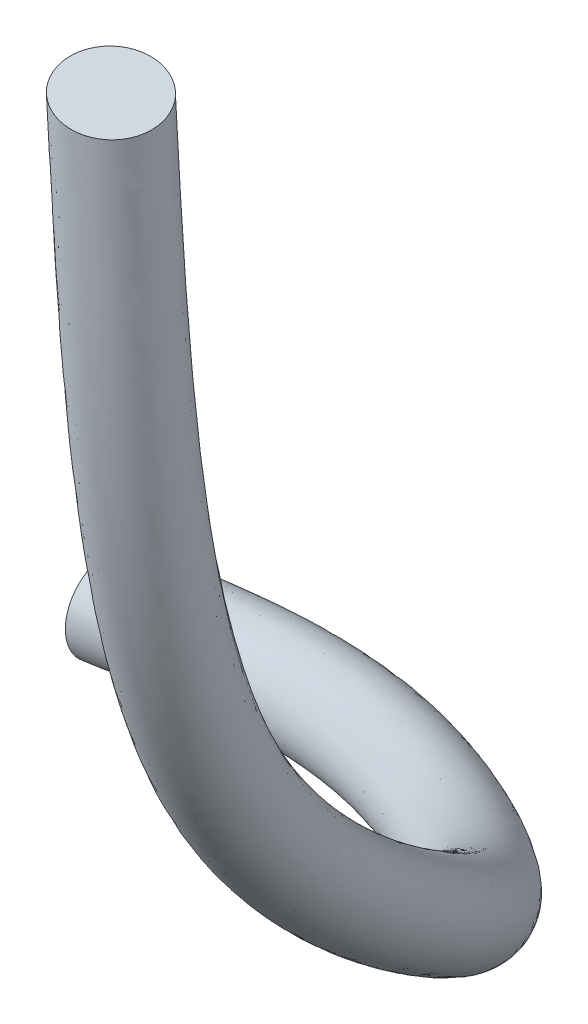
ISO-10303-21;
HEADER;
FILE_DESCRIPTION(('STEP AP214'),'2;1');
FILE_NAME('part.step','',(''),(''),'','','');
FILE_SCHEMA(('AUTOMOTIVE_DESIGN { 1 0 10303 214 1 1 1 1 }'));
ENDSEC;
DATA;
#1=APPLICATION_CONTEXT('core data for automotive mechanical design processes');
#2=APPLICATION_PROTOCOL_DEFINITION('international standard','automotive_design',2000,#1);
#3=PRODUCT_CONTEXT('',#1,'mechanical');
#4=PRODUCT('Part','Part','',(#3));
#5=PRODUCT_RELATED_PRODUCT_CATEGORY('part','',(#4));
#6=PRODUCT_DEFINITION_FORMATION('','',#4);
#7=PRODUCT_DEFINITION_CONTEXT('part definition',#1,'design');
#8=PRODUCT_DEFINITION('design','',#6,#7);
#9=PRODUCT_DEFINITION_SHAPE('','',#8);
#10=(LENGTH_UNIT() NAMED_UNIT(*) SI_UNIT(.MILLI.,.METRE.));
#11=(NAMED_UNIT(*) PLANE_ANGLE_UNIT() SI_UNIT($,.RADIAN.));
#12=(NAMED_UNIT(*) SI_UNIT($,.STERADIAN.) SOLID_ANGLE_UNIT());
#13=UNCERTAINTY_MEASURE_WITH_UNIT(LENGTH_MEASURE(1.E-05),#10,'distance_accuracy_value','');
#14=(GEOMETRIC_REPRESENTATION_CONTEXT(3) GLOBAL_UNCERTAINTY_ASSIGNED_CONTEXT((#13)) GLOBAL_UNIT_ASSIGNED_CONTEXT((#10,
#11,#12)) REPRESENTATION_CONTEXT('',''));
#15=CARTESIAN_POINT('',(0.,0.,0.));
#16=DIRECTION('',(0.,0.,1.));
#17=DIRECTION('',(1.,0.,0.));
#18=AXIS2_PLACEMENT_3D('',#15,#16,#17);
#19=CARTESIAN_POINT('',(0.,0.,0.));
#20=DIRECTION('',(1.,0.,0.));
#21=DIRECTION('',(0.,0.,-1.));
#22=AXIS2_PLACEMENT_3D('',#19,#20,#21);
#23=PLANE('',#22);
#24=CARTESIAN_POINT('',(0.,0.,0.));
#25=DIRECTION('',(1.,0.,0.));
#26=DIRECTION('',(0.,0.,-1.));
#27=AXIS2_PLACEMENT_3D('',#24,#25,#26);
#28=CIRCLE('',#27,1.725);
#29=CARTESIAN_POINT('',(0.,0.,-1.725));
#30=VERTEX_POINT('',#29);
#31=EDGE_CURVE('E41',#30,#30,#28,.T.);
#32=ORIENTED_EDGE('',*,*,#31,.F.);
#33=EDGE_LOOP('',(#32));
#34=FACE_BOUND('',#33,.T.);
#35=ADVANCED_FACE('F34',(#34),#23,.F.);
#36=CARTESIAN_POINT('',(33.325,50.,33.325));
#37=DIRECTION('',(0.151048514749454,0.980275534703042,0.127452823643295));
#38=DIRECTION('',(0.73118730682024,-0.0240272753456375,-0.681753483588043));
#39=AXIS2_PLACEMENT_3D('',#36,#37,#38);
#40=PLANE('',#39);
#41=CARTESIAN_POINT('',(33.325,50.,33.325));
#42=DIRECTION('',(0.151048514749454,0.980275534703042,0.127452823643295));
#43=DIRECTION('',(0.73118730682024,-0.0240272753456375,-0.681753483588043));
#44=AXIS2_PLACEMENT_3D('',#41,#42,#43);
#45=CIRCLE('',#44,1.725);
#46=CARTESIAN_POINT('',(34.5862981042649,49.9585529500288,32.1489752408106));
#47=VERTEX_POINT('',#46);
#48=EDGE_CURVE('E11',#47,#47,#45,.T.);
#49=ORIENTED_EDGE('',*,*,#48,.T.);
#50=EDGE_LOOP('',(#49));
#51=FACE_BOUND('',#50,.T.);
#52=ADVANCED_FACE('F48',(#51),#40,.T.);
#53=CARTESIAN_POINT('',(0.,0.,-1.725));
#54=CARTESIAN_POINT('',(2.48000317880168,0.50129223448542,-1.56322730421922));
#55=CARTESIAN_POINT('',(5.0374034123841,1.01598789768122,-1.40681368496073));
#56=CARTESIAN_POINT('',(9.81873012394712,2.12539100860126,-0.431128233178306));
#57=CARTESIAN_POINT('',(11.9669003907719,2.68549016663123,0.292812922235282));
#58=CARTESIAN_POINT('',(17.3049166613657,4.16741612285017,2.68198316766889));
#59=CARTESIAN_POINT('',(20.3448816550532,5.10031355020859,4.65238331825413));
#60=CARTESIAN_POINT('',(25.9097633851972,8.12202470659819,9.40133914024294));
#61=CARTESIAN_POINT('',(28.2639436207007,10.4045648975485,12.2759735974784));
#62=CARTESIAN_POINT('',(31.2567388976018,14.7457249483589,17.6517766511387));
#63=CARTESIAN_POINT('',(32.1707296658546,16.6573073425701,19.9974008242209));
#64=CARTESIAN_POINT('',(33.5275469116092,20.7764241056321,24.2644656413604));
#65=CARTESIAN_POINT('',(33.9693678929701,22.9831500345905,26.1837189159665));
#66=CARTESIAN_POINT('',(34.6905747628355,28.7581197986345,29.6191105930435));
#67=CARTESIAN_POINT('',(34.8409973609579,32.6492258332364,30.7046413305523));
#68=CARTESIAN_POINT('',(34.8572530940914,41.0089997508734,31.9124144948552));
#69=CARTESIAN_POINT('',(34.7230479542006,45.4691962097857,32.033353650291));
#70=CARTESIAN_POINT('',(34.5862981042649,49.9585529500288,32.1489752408106));
#71=CARTESIAN_POINT('',(0.,3.45,-1.725));
#72=CARTESIAN_POINT('',(2.48000317879998,3.95129223448542,-1.56322730421867));
#73=CARTESIAN_POINT('',(5.00610816957797,4.46683409496257,-1.3755487213069));
#74=CARTESIAN_POINT('',(9.64975771332741,5.5699382120425,-0.308856498486901));
#75=CARTESIAN_POINT('',(11.7441429937837,6.12524449182834,0.446236899316048));
#76=CARTESIAN_POINT('',(16.9718851782534,7.59489355944229,2.90693032030654));
#77=CARTESIAN_POINT('',(19.7991150620764,8.52218340416068,4.83748263878359));
#78=CARTESIAN_POINT('',(24.6868506902211,11.3698214761406,9.17591848878748));
#79=CARTESIAN_POINT('',(26.8049475647862,13.5110161133131,11.8494123995535));
#80=CARTESIAN_POINT('',(29.526560979758,17.6585960909953,16.9776779121885));
#81=CARTESIAN_POINT('',(30.3417304206714,19.4756532462081,19.1735441981059));
#82=CARTESIAN_POINT('',(31.5242116060461,23.3214435014604,23.0493213955685));
#83=CARTESIAN_POINT('',(31.8897848650537,25.3479561232734,24.7197379648663));
#84=CARTESIAN_POINT('',(32.4605613484819,30.4292678734379,27.508749544881));
#85=CARTESIAN_POINT('',(32.5777949702547,33.9210562141235,28.4178389279097));
#86=CARTESIAN_POINT('',(32.5631082532481,41.7979556391341,29.4459289655493));
#87=CARTESIAN_POINT('',(32.4279564420248,46.1459818058352,29.5479932724762));
#88=CARTESIAN_POINT('',(32.2912065920892,50.6353385460861,29.6636148629764));
#89=CARTESIAN_POINT('',(0.,3.45,1.725));
#90=CARTESIAN_POINT('',(2.48000317879965,3.95129223448445,1.88677269578133));
#91=CARTESIAN_POINT('',(4.85131405717485,4.44002724019109,2.08516944595988));
#92=CARTESIAN_POINT('',(8.92601314543176,5.41893895536279,3.07207802397309));
#93=CARTESIAN_POINT('',(10.7945214118084,5.91767015546996,3.76329748353631));
#94=CARTESIAN_POINT('',(15.5187045387128,7.25317959297611,6.03590311043839));
#95=CARTESIAN_POINT('',(18.1095098569944,8.11690743577873,7.8276521661151));
#96=CARTESIAN_POINT('',(22.5934800551603,10.806723041815,11.8746093068232));
#97=CARTESIAN_POINT('',(24.5352455327911,12.8120307729323,14.3675564716333));
#98=CARTESIAN_POINT('',(27.0297784475347,16.693167249732,19.163412107063));
#99=CARTESIAN_POINT('',(27.8128484113254,18.4526108286546,21.2856330259773));
#100=CARTESIAN_POINT('',(28.97288429476,22.3127082431334,25.1412012562528));
#101=CARTESIAN_POINT('',(29.3501227174692,24.4127584787432,26.8694289759845));
#102=CARTESIAN_POINT('',(29.9567018515868,29.9556013183021,29.8529995993479));
#103=CARTESIAN_POINT('',(30.0696948099717,33.6758208514515,30.7779271084593));
#104=CARTESIAN_POINT('',(30.0456014632327,41.8225291786692,31.8086136083445));
#105=CARTESIAN_POINT('',(29.9053602335379,46.2288759057464,31.9000427908589));
#106=CARTESIAN_POINT('',(29.7686103835594,50.7182326460285,32.0156643813551));
#107=CARTESIAN_POINT('',(0.,0.,1.725));
#108=CARTESIAN_POINT('',(2.48000317880135,0.501292234484449,1.88677269578078));
#109=CARTESIAN_POINT('',(4.88260929998098,0.989181042909736,2.05390448230577));
#110=CARTESIAN_POINT('',(9.09498555605147,1.97439175192155,2.94980628928192));
#111=CARTESIAN_POINT('',(11.0172788087966,2.47791583027284,3.60987350645555));
#112=CARTESIAN_POINT('',(15.851736021825,3.82570215638398,5.81095595780073));
#113=CARTESIAN_POINT('',(18.6552764499681,4.69503758182779,7.64255284558488));
#114=CARTESIAN_POINT('',(23.81639275014,7.5589262722713,12.1000299582795));
#115=CARTESIAN_POINT('',(25.9942415887057,9.70557955716773,14.7941176695582));
#116=CARTESIAN_POINT('',(28.7599563653784,13.7802961070956,19.8375108460132));
#117=CARTESIAN_POINT('',(29.6418476565086,15.6342649250166,22.1094896520922));
#118=CARTESIAN_POINT('',(30.976219600323,19.7676888473051,26.3563455020447));
#119=CARTESIAN_POINT('',(31.4297057453856,22.0479523900603,28.3334099270898));
#120=CARTESIAN_POINT('',(32.1867152659404,28.2844532434987,31.9633606475033));
#121=CARTESIAN_POINT('',(32.3328972006787,32.4039904705644,33.0647295111018));
#122=CARTESIAN_POINT('',(32.3397463040724,41.0335732904085,34.2750991376503));
#123=CARTESIAN_POINT('',(32.2004517457019,45.552090309697,34.3854031686697));
#124=CARTESIAN_POINT('',(32.0637018957351,50.0414470499712,34.5010247591894));
#125=CARTESIAN_POINT('',(0.,-3.45,1.725));
#126=CARTESIAN_POINT('',(2.48000317880305,-2.94870776551555,1.88677269578023));
#127=CARTESIAN_POINT('',(4.91390454278712,-2.46166515437162,2.02263951865167));
#128=CARTESIAN_POINT('',(9.26395796667118,-1.47015545151969,2.82753455459075));
#129=CARTESIAN_POINT('',(11.2400362057847,-0.961838494924274,3.45644952937478));
#130=CARTESIAN_POINT('',(16.1847675049373,0.398224719791859,5.58600880516308));
#131=CARTESIAN_POINT('',(19.2010430429419,1.27316772787685,7.45745352505465));
#132=CARTESIAN_POINT('',(25.0393054451197,4.31112950272757,12.3254506097359));
#133=CARTESIAN_POINT('',(27.4532376446203,6.59912834140313,15.2206788674832));
#134=CARTESIAN_POINT('',(30.4901342832222,10.8674249644592,20.5116095849634));
#135=CARTESIAN_POINT('',(31.4708469016919,12.8159190213786,22.9333462782072));
#136=CARTESIAN_POINT('',(32.9795549058861,17.2226694514768,27.5714897478366));
#137=CARTESIAN_POINT('',(33.509288773302,19.6831463013774,29.7973908781951));
#138=CARTESIAN_POINT('',(34.4167286802941,26.6133051686952,34.0737216956587));
#139=CARTESIAN_POINT('',(34.5960995913857,31.1321600896773,35.3515319137444));
#140=CARTESIAN_POINT('',(34.633891144912,40.2446174021478,36.7415846669561));
#141=CARTESIAN_POINT('',(34.4955432578659,44.8753047136475,36.8707635464806));
#142=CARTESIAN_POINT('',(34.3587934079108,49.364661453914,36.9863851370236));
#143=CARTESIAN_POINT('',(0.,-3.45,-1.725));
#144=CARTESIAN_POINT('',(2.48000317880338,-2.94870776551458,-1.56322730421977));
#145=CARTESIAN_POINT('',(5.06869865519023,-2.43485829960014,-1.43807864861456));
#146=CARTESIAN_POINT('',(9.98770253456684,-1.31915619483998,-0.55339996786971));
#147=CARTESIAN_POINT('',(12.1896577877601,-0.754264158565889,0.139388945154516));
#148=CARTESIAN_POINT('',(17.6379481444779,0.739938686258044,2.45703601503123));
#149=CARTESIAN_POINT('',(20.8906482480301,1.67844369625651,4.46728399772467));
#150=CARTESIAN_POINT('',(27.1326760801733,4.87422793705582,9.62675979169841));
#151=CARTESIAN_POINT('',(29.7229396766153,7.29811368178389,12.7025347954033));
#152=CARTESIAN_POINT('',(32.9869168154456,11.8328538057225,18.3258753900889));
#153=CARTESIAN_POINT('',(33.9997289110379,13.8389614389321,20.8212574503358));
#154=CARTESIAN_POINT('',(35.5308822171722,18.2314047098037,25.4796098871523));
#155=CARTESIAN_POINT('',(36.0489509208865,20.6183439459076,27.6476998670668));
#156=CARTESIAN_POINT('',(36.9205881771892,27.086971723831,31.7294716412061));
#157=CARTESIAN_POINT('',(37.1041997516612,31.3773954523493,32.9914437331948));
#158=CARTESIAN_POINT('',(37.1513979349348,40.2200438626126,34.378900024161));
#159=CARTESIAN_POINT('',(37.0181394663763,44.7924106137362,34.5187140281057));
#160=CARTESIAN_POINT('',(36.8813896164407,49.2817673539715,34.6343356186449));
#161=CARTESIAN_POINT('',(0.,0.,-1.725));
#162=CARTESIAN_POINT('',(2.48000317880168,0.50129223448542,-1.56322730421922));
#163=CARTESIAN_POINT('',(5.0374034123841,1.01598789768122,-1.40681368496073));
#164=CARTESIAN_POINT('',(9.81873012394712,2.12539100860126,-0.431128233178306));
#165=CARTESIAN_POINT('',(11.9669003907719,2.68549016663123,0.292812922235282));
#166=CARTESIAN_POINT('',(17.3049166613657,4.16741612285017,2.68198316766889));
#167=CARTESIAN_POINT('',(20.3448816550532,5.10031355020859,4.65238331825413));
#168=CARTESIAN_POINT('',(25.9097633851972,8.12202470659819,9.40133914024294));
#169=CARTESIAN_POINT('',(28.2639436207007,10.4045648975485,12.2759735974784));
#170=CARTESIAN_POINT('',(31.2567388976018,14.7457249483589,17.6517766511387));
#171=CARTESIAN_POINT('',(32.1707296658546,16.6573073425701,19.9974008242209));
#172=CARTESIAN_POINT('',(33.5275469116092,20.7764241056321,24.2644656413604));
#173=CARTESIAN_POINT('',(33.9693678929701,22.9831500345905,26.1837189159665));
#174=CARTESIAN_POINT('',(34.6905747628355,28.7581197986345,29.6191105930435));
#175=CARTESIAN_POINT('',(34.8409973609579,32.6492258332364,30.7046413305523));
#176=CARTESIAN_POINT('',(34.8572530940914,41.0089997508734,31.9124144948552));
#177=CARTESIAN_POINT('',(34.7230479542006,45.4691962097857,32.033353650291));
#178=CARTESIAN_POINT('',(34.5862981042649,49.9585529500288,32.1489752408106));
#179=(BOUNDED_SURFACE() B_SPLINE_SURFACE(3,3,((#53,#54,#55,#56,#57,#58,#59,#60,#61,#62,#63,#64,
#65,#66,#67,#68,#69,#70),(#71,#72,#73,#74,#75,#76,#77,#78,#79,#80,#81,#82,#83,#84,#85,#86,#87,
#88),(#89,#90,#91,#92,#93,#94,#95,#96,#97,#98,#99,#100,#101,#102,#103,#104,#105,#106),(#107,
#108,#109,#110,#111,#112,#113,#114,#115,#116,#117,#118,#119,#120,#121,#122,#123,#124),(#125,
#126,#127,#128,#129,#130,#131,#132,#133,#134,#135,#136,#137,#138,#139,#140,#141,#142),(#143,
#144,#145,#146,#147,#148,#149,#150,#151,#152,#153,#154,#155,#156,#157,#158,#159,#160),(#161,
#162,#163,#164,#165,#166,#167,#168,#169,#170,#171,#172,#173,#174,#175,#176,#177,#178)),
.UNSPECIFIED.,.T.,.F.,.F.) B_SPLINE_SURFACE_WITH_KNOTS((4,3,4),(4,2,2,2,2,2,2,2,4),(0.,0.5,1.),
(0.,0.0940313148966537,0.175883040601529,0.307189893811202,0.461620536619214,0.572978774731913,
0.684337012844613,0.842168506422306,1.),
.UNSPECIFIED.) GEOMETRIC_REPRESENTATION_ITEM() RATIONAL_B_SPLINE_SURFACE(((1.,1.,1.,1.,1.,1.,1.,
1.,1.,1.,1.,1.,1.,1.,1.,1.,1.,1.),(0.333333333333333,0.333333333333333,0.333333333333333,
0.333333333333333,0.333333333333333,0.333333333333333,0.333333333333333,0.333333333333333,
0.333333333333333,0.333333333333333,0.333333333333333,0.333333333333333,0.333333333333333,
0.333333333333333,0.333333333333333,0.333333333333333,0.333333333333333,0.333333333333333),
(0.333333333333333,0.333333333333333,0.333333333333333,0.333333333333333,0.333333333333333,
0.333333333333333,0.333333333333333,0.333333333333333,0.333333333333333,0.333333333333333,
0.333333333333333,0.333333333333333,0.333333333333333,0.333333333333333,0.333333333333333,
0.333333333333333,0.333333333333333,0.333333333333333),(1.,1.,1.,1.,1.,1.,1.,1.,1.,1.,1.,1.,1.,
1.,1.,1.,1.,1.),(0.333333333333333,0.333333333333333,0.333333333333333,0.333333333333333,
0.333333333333333,0.333333333333333,0.333333333333333,0.333333333333333,0.333333333333333,
0.333333333333333,0.333333333333333,0.333333333333333,0.333333333333333,0.333333333333333,
0.333333333333333,0.333333333333333,0.333333333333333,0.333333333333333),(0.333333333333333,
0.333333333333333,0.333333333333333,0.333333333333333,0.333333333333333,0.333333333333333,
0.333333333333333,0.333333333333333,0.333333333333333,0.333333333333333,0.333333333333333,
0.333333333333333,0.333333333333333,0.333333333333333,0.333333333333333,0.333333333333333,
0.333333333333333,0.333333333333333),(1.,1.,1.,1.,1.,1.,1.,1.,1.,1.,1.,1.,1.,1.,1.,1.,1.,1.))) REPRESENTATION_ITEM('') SURFACE());
#180=ORIENTED_EDGE('',*,*,#48,.F.);
#181=EDGE_LOOP('',(#180));
#182=FACE_BOUND('',#181,.T.);
#183=ORIENTED_EDGE('',*,*,#31,.T.);
#184=EDGE_LOOP('',(#183));
#185=FACE_BOUND('',#184,.T.);
#186=ADVANCED_FACE('F50',(#182,#185),#179,.T.);
#187=CLOSED_SHELL('',(#35,#52,#186));
#188=MANIFOLD_SOLID_BREP('B2',#187);
#189=ADVANCED_BREP_SHAPE_REPRESENTATION('',(#18,#188),#14);
#190=SHAPE_DEFINITION_REPRESENTATION(#9,#189);
ENDSEC;
END-ISO-10303-21;
